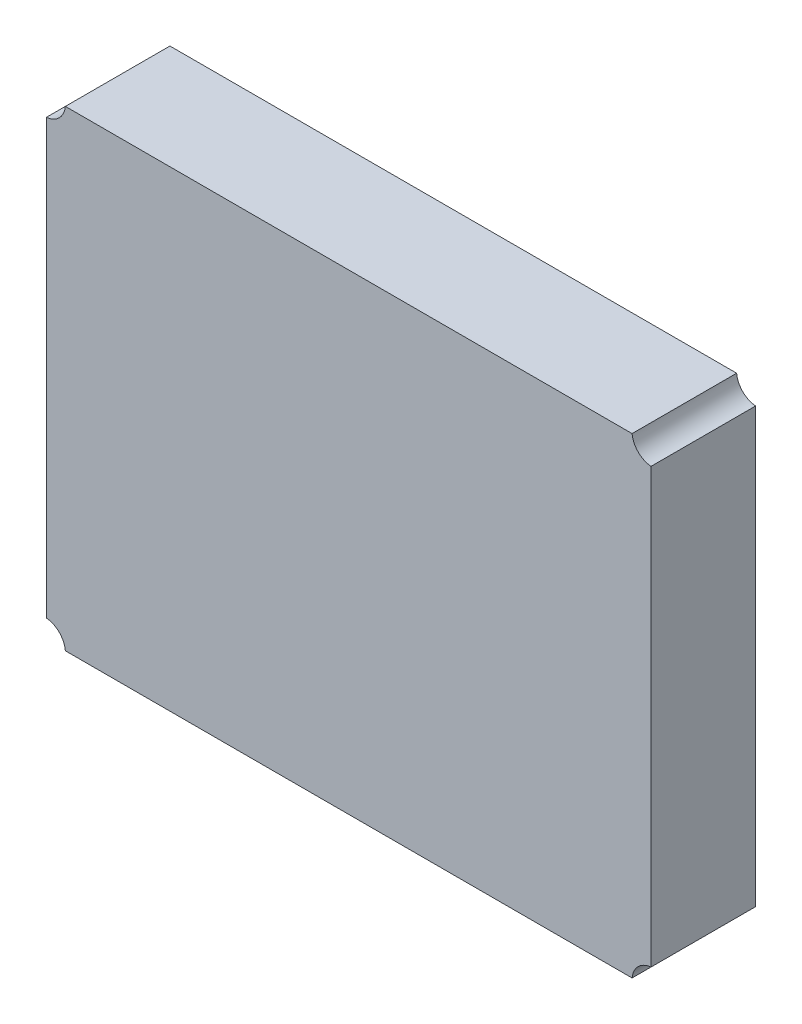
ISO-10303-21;
HEADER;
FILE_DESCRIPTION(('STEP AP214'),'2;1');
FILE_NAME('part.step','',(''),(''),'','','');
FILE_SCHEMA(('AUTOMOTIVE_DESIGN { 1 0 10303 214 1 1 1 1 }'));
ENDSEC;
DATA;
#1=APPLICATION_CONTEXT('core data for automotive mechanical design processes');
#2=APPLICATION_PROTOCOL_DEFINITION('international standard','automotive_design',2000,#1);
#3=PRODUCT_CONTEXT('',#1,'mechanical');
#4=PRODUCT('Part','Part','',(#3));
#5=PRODUCT_RELATED_PRODUCT_CATEGORY('part','',(#4));
#6=PRODUCT_DEFINITION_FORMATION('','',#4);
#7=PRODUCT_DEFINITION_CONTEXT('part definition',#1,'design');
#8=PRODUCT_DEFINITION('design','',#6,#7);
#9=PRODUCT_DEFINITION_SHAPE('','',#8);
#10=(LENGTH_UNIT() NAMED_UNIT(*) SI_UNIT(.MILLI.,.METRE.));
#11=(NAMED_UNIT(*) PLANE_ANGLE_UNIT() SI_UNIT($,.RADIAN.));
#12=(NAMED_UNIT(*) SI_UNIT($,.STERADIAN.) SOLID_ANGLE_UNIT());
#13=UNCERTAINTY_MEASURE_WITH_UNIT(LENGTH_MEASURE(1.E-05),#10,'distance_accuracy_value','');
#14=(GEOMETRIC_REPRESENTATION_CONTEXT(3) GLOBAL_UNCERTAINTY_ASSIGNED_CONTEXT((#13)) GLOBAL_UNIT_ASSIGNED_CONTEXT((#10,
#11,#12)) REPRESENTATION_CONTEXT('',''));
#15=CARTESIAN_POINT('',(0.,0.,0.));
#16=DIRECTION('',(0.,0.,1.));
#17=DIRECTION('',(1.,0.,0.));
#18=AXIS2_PLACEMENT_3D('',#15,#16,#17);
#19=CARTESIAN_POINT('',(-1.59,-1.24,0.05));
#20=DIRECTION('',(0.,0.,-1.));
#21=DIRECTION('',(-1.,0.,0.));
#22=AXIS2_PLACEMENT_3D('',#19,#20,#21);
#23=PLANE('',#22);
#24=DIRECTION('',(0.,1.,0.));
#25=VECTOR('',#24,1.);
#26=CARTESIAN_POINT('',(-1.59,-1.140455488499,0.05));
#27=LINE('',#26,#25);
#28=CARTESIAN_POINT('',(-1.59,1.14045548849897,0.05));
#29=VERTEX_POINT('',#28);
#30=CARTESIAN_POINT('',(-1.59,-1.14045548849897,0.05));
#31=VERTEX_POINT('',#30);
#32=EDGE_CURVE('E107',#29,#31,#27,.F.);
#33=ORIENTED_EDGE('',*,*,#32,.F.);
#34=CARTESIAN_POINT('',(-1.6,1.25,0.0499999999999999));
#35=DIRECTION('',(0.,0.,-1.));
#36=DIRECTION('',(-1.,0.,0.));
#37=AXIS2_PLACEMENT_3D('',#34,#35,#36);
#38=CIRCLE('',#37,0.11);
#39=CARTESIAN_POINT('',(-1.49045548849897,1.24,0.05));
#40=VERTEX_POINT('',#39);
#41=EDGE_CURVE('E110',#29,#40,#38,.F.);
#42=ORIENTED_EDGE('',*,*,#41,.T.);
#43=DIRECTION('',(1.,0.,0.));
#44=VECTOR('',#43,1.);
#45=CARTESIAN_POINT('',(-1.490455488499,1.24,0.05));
#46=LINE('',#45,#44);
#47=CARTESIAN_POINT('',(1.49045548849897,1.24,0.05));
#48=VERTEX_POINT('',#47);
#49=EDGE_CURVE('E114',#48,#40,#46,.F.);
#50=ORIENTED_EDGE('',*,*,#49,.F.);
#51=CARTESIAN_POINT('',(1.6,1.25,0.0499999999999999));
#52=DIRECTION('',(0.,0.,-1.));
#53=DIRECTION('',(-1.,0.,0.));
#54=AXIS2_PLACEMENT_3D('',#51,#52,#53);
#55=CIRCLE('',#54,0.11);
#56=CARTESIAN_POINT('',(1.59,1.14045548849897,0.05));
#57=VERTEX_POINT('',#56);
#58=EDGE_CURVE('E117',#48,#57,#55,.F.);
#59=ORIENTED_EDGE('',*,*,#58,.T.);
#60=DIRECTION('',(0.,1.,0.));
#61=VECTOR('',#60,1.);
#62=CARTESIAN_POINT('',(1.59,1.140455488499,0.05));
#63=LINE('',#62,#61);
#64=CARTESIAN_POINT('',(1.59,-1.14045548849897,0.05));
#65=VERTEX_POINT('',#64);
#66=EDGE_CURVE('E86',#65,#57,#63,.T.);
#67=ORIENTED_EDGE('',*,*,#66,.F.);
#68=CARTESIAN_POINT('',(1.6,-1.25,0.0499999999999999));
#69=DIRECTION('',(0.,0.,-1.));
#70=DIRECTION('',(-1.,0.,0.));
#71=AXIS2_PLACEMENT_3D('',#68,#69,#70);
#72=CIRCLE('',#71,0.11);
#73=CARTESIAN_POINT('',(1.49045548849897,-1.24,0.05));
#74=VERTEX_POINT('',#73);
#75=EDGE_CURVE('E19',#65,#74,#72,.F.);
#76=ORIENTED_EDGE('',*,*,#75,.T.);
#77=DIRECTION('',(1.,0.,0.));
#78=VECTOR('',#77,1.);
#79=CARTESIAN_POINT('',(1.490455488499,-1.24,0.05));
#80=LINE('',#79,#78);
#81=CARTESIAN_POINT('',(-1.49045548849897,-1.24,0.05));
#82=VERTEX_POINT('',#81);
#83=EDGE_CURVE('E83',#82,#74,#80,.T.);
#84=ORIENTED_EDGE('',*,*,#83,.F.);
#85=CARTESIAN_POINT('',(-1.6,-1.25,0.0499999999999999));
#86=DIRECTION('',(0.,0.,-1.));
#87=DIRECTION('',(-1.,0.,0.));
#88=AXIS2_PLACEMENT_3D('',#85,#86,#87);
#89=CIRCLE('',#88,0.11);
#90=EDGE_CURVE('E103',#82,#31,#89,.F.);
#91=ORIENTED_EDGE('',*,*,#90,.T.);
#92=EDGE_LOOP('',(#33,#42,#50,#59,#67,#76,#84,#91));
#93=FACE_BOUND('',#92,.T.);
#94=ADVANCED_FACE('F16',(#93),#23,.T.);
#95=CARTESIAN_POINT('',(1.59,1.140455488499,0.05));
#96=DIRECTION('',(1.,0.,0.));
#97=DIRECTION('',(0.,0.,-1.));
#98=AXIS2_PLACEMENT_3D('',#95,#96,#97);
#99=PLANE('',#98);
#100=ORIENTED_EDGE('',*,*,#66,.T.);
#101=DIRECTION('',(0.,0.,-1.));
#102=VECTOR('',#101,1.);
#103=CARTESIAN_POINT('',(1.59,1.14045548849897,0.6));
#104=LINE('',#103,#102);
#105=CARTESIAN_POINT('',(1.59,1.14045548849897,0.6));
#106=VERTEX_POINT('',#105);
#107=EDGE_CURVE('E115',#57,#106,#104,.F.);
#108=ORIENTED_EDGE('',*,*,#107,.T.);
#109=DIRECTION('',(0.,1.,0.));
#110=VECTOR('',#109,1.);
#111=CARTESIAN_POINT('',(1.59,-1.24,0.6));
#112=LINE('',#111,#110);
#113=CARTESIAN_POINT('',(1.59,-1.14045548849897,0.6));
#114=VERTEX_POINT('',#113);
#115=EDGE_CURVE('E95',#114,#106,#112,.T.);
#116=ORIENTED_EDGE('',*,*,#115,.F.);
#117=DIRECTION('',(0.,0.,-1.));
#118=VECTOR('',#117,1.);
#119=CARTESIAN_POINT('',(1.59,-1.14045548849897,0.6));
#120=LINE('',#119,#118);
#121=EDGE_CURVE('E93',#114,#65,#120,.T.);
#122=ORIENTED_EDGE('',*,*,#121,.T.);
#123=EDGE_LOOP('',(#100,#108,#116,#122));
#124=FACE_BOUND('',#123,.T.);
#125=ADVANCED_FACE('F139',(#124),#99,.T.);
#126=CARTESIAN_POINT('',(1.6,1.25,0.6));
#127=DIRECTION('',(0.,0.,-1.));
#128=DIRECTION('',(-1.,0.,0.));
#129=AXIS2_PLACEMENT_3D('',#126,#127,#128);
#130=CYLINDRICAL_SURFACE('',#129,0.11);
#131=ORIENTED_EDGE('',*,*,#107,.F.);
#132=ORIENTED_EDGE('',*,*,#58,.F.);
#133=DIRECTION('',(0.,0.,1.));
#134=VECTOR('',#133,1.);
#135=CARTESIAN_POINT('',(1.49045548849897,1.24,0.05));
#136=LINE('',#135,#134);
#137=CARTESIAN_POINT('',(1.49045548849897,1.24,0.6));
#138=VERTEX_POINT('',#137);
#139=EDGE_CURVE('E111',#138,#48,#136,.F.);
#140=ORIENTED_EDGE('',*,*,#139,.F.);
#141=CARTESIAN_POINT('',(1.6,1.25,0.6));
#142=DIRECTION('',(0.,0.,-1.));
#143=DIRECTION('',(-1.,0.,0.));
#144=AXIS2_PLACEMENT_3D('',#141,#142,#143);
#145=CIRCLE('',#144,0.11);
#146=EDGE_CURVE('E131',#106,#138,#145,.T.);
#147=ORIENTED_EDGE('',*,*,#146,.F.);
#148=EDGE_LOOP('',(#131,#132,#140,#147));
#149=FACE_BOUND('',#148,.T.);
#150=ADVANCED_FACE('F141',(#149),#130,.F.);
#151=CARTESIAN_POINT('',(-1.490455488499,1.24,0.05));
#152=DIRECTION('',(0.,1.,0.));
#153=DIRECTION('',(0.,0.,1.));
#154=AXIS2_PLACEMENT_3D('',#151,#152,#153);
#155=PLANE('',#154);
#156=ORIENTED_EDGE('',*,*,#49,.T.);
#157=DIRECTION('',(0.,0.,-1.));
#158=VECTOR('',#157,1.);
#159=CARTESIAN_POINT('',(-1.49045548849897,1.24,0.6));
#160=LINE('',#159,#158);
#161=CARTESIAN_POINT('',(-1.49045548849897,1.24,0.6));
#162=VERTEX_POINT('',#161);
#163=EDGE_CURVE('E108',#40,#162,#160,.F.);
#164=ORIENTED_EDGE('',*,*,#163,.T.);
#165=DIRECTION('',(1.,0.,0.));
#166=VECTOR('',#165,1.);
#167=CARTESIAN_POINT('',(-1.59,1.24,0.6));
#168=LINE('',#167,#166);
#169=EDGE_CURVE('E130',#138,#162,#168,.F.);
#170=ORIENTED_EDGE('',*,*,#169,.F.);
#171=ORIENTED_EDGE('',*,*,#139,.T.);
#172=EDGE_LOOP('',(#156,#164,#170,#171));
#173=FACE_BOUND('',#172,.T.);
#174=ADVANCED_FACE('F153',(#173),#155,.T.);
#175=CARTESIAN_POINT('',(-1.6,1.25,0.6));
#176=DIRECTION('',(0.,0.,-1.));
#177=DIRECTION('',(-1.,0.,0.));
#178=AXIS2_PLACEMENT_3D('',#175,#176,#177);
#179=CYLINDRICAL_SURFACE('',#178,0.11);
#180=CARTESIAN_POINT('',(-1.6,1.25,0.6));
#181=DIRECTION('',(0.,0.,-1.));
#182=DIRECTION('',(-1.,0.,0.));
#183=AXIS2_PLACEMENT_3D('',#180,#181,#182);
#184=CIRCLE('',#183,0.11);
#185=CARTESIAN_POINT('',(-1.59,1.14045548849897,0.6));
#186=VERTEX_POINT('',#185);
#187=EDGE_CURVE('E127',#162,#186,#184,.T.);
#188=ORIENTED_EDGE('',*,*,#187,.F.);
#189=ORIENTED_EDGE('',*,*,#163,.F.);
#190=ORIENTED_EDGE('',*,*,#41,.F.);
#191=DIRECTION('',(0.,0.,1.));
#192=VECTOR('',#191,1.);
#193=CARTESIAN_POINT('',(-1.59,1.14045548849897,0.05));
#194=LINE('',#193,#192);
#195=EDGE_CURVE('E104',#186,#29,#194,.F.);
#196=ORIENTED_EDGE('',*,*,#195,.F.);
#197=EDGE_LOOP('',(#188,#189,#190,#196));
#198=FACE_BOUND('',#197,.T.);
#199=ADVANCED_FACE('F156',(#198),#179,.F.);
#200=CARTESIAN_POINT('',(-1.59,-1.140455488499,0.05));
#201=DIRECTION('',(-1.,0.,0.));
#202=DIRECTION('',(0.,0.,1.));
#203=AXIS2_PLACEMENT_3D('',#200,#201,#202);
#204=PLANE('',#203);
#205=ORIENTED_EDGE('',*,*,#32,.T.);
#206=DIRECTION('',(0.,0.,-1.));
#207=VECTOR('',#206,1.);
#208=CARTESIAN_POINT('',(-1.59,-1.14045548849897,0.6));
#209=LINE('',#208,#207);
#210=CARTESIAN_POINT('',(-1.59,-1.14045548849897,0.6));
#211=VERTEX_POINT('',#210);
#212=EDGE_CURVE('E101',#31,#211,#209,.F.);
#213=ORIENTED_EDGE('',*,*,#212,.T.);
#214=DIRECTION('',(0.,1.,0.));
#215=VECTOR('',#214,1.);
#216=CARTESIAN_POINT('',(-1.59,-1.24,0.6));
#217=LINE('',#216,#215);
#218=EDGE_CURVE('E126',#186,#211,#217,.F.);
#219=ORIENTED_EDGE('',*,*,#218,.F.);
#220=ORIENTED_EDGE('',*,*,#195,.T.);
#221=EDGE_LOOP('',(#205,#213,#219,#220));
#222=FACE_BOUND('',#221,.T.);
#223=ADVANCED_FACE('F159',(#222),#204,.T.);
#224=CARTESIAN_POINT('',(-1.6,-1.25,0.6));
#225=DIRECTION('',(0.,0.,-1.));
#226=DIRECTION('',(-1.,0.,0.));
#227=AXIS2_PLACEMENT_3D('',#224,#225,#226);
#228=CYLINDRICAL_SURFACE('',#227,0.11);
#229=ORIENTED_EDGE('',*,*,#212,.F.);
#230=ORIENTED_EDGE('',*,*,#90,.F.);
#231=DIRECTION('',(0.,0.,-1.));
#232=VECTOR('',#231,1.);
#233=CARTESIAN_POINT('',(-1.49045548849897,-1.24,0.05));
#234=LINE('',#233,#232);
#235=CARTESIAN_POINT('',(-1.49045548849897,-1.24,0.6));
#236=VERTEX_POINT('',#235);
#237=EDGE_CURVE('E89',#236,#82,#234,.T.);
#238=ORIENTED_EDGE('',*,*,#237,.F.);
#239=CARTESIAN_POINT('',(-1.6,-1.25,0.6));
#240=DIRECTION('',(0.,0.,-1.));
#241=DIRECTION('',(-1.,0.,0.));
#242=AXIS2_PLACEMENT_3D('',#239,#240,#241);
#243=CIRCLE('',#242,0.11);
#244=EDGE_CURVE('E123',#211,#236,#243,.T.);
#245=ORIENTED_EDGE('',*,*,#244,.F.);
#246=EDGE_LOOP('',(#229,#230,#238,#245));
#247=FACE_BOUND('',#246,.T.);
#248=ADVANCED_FACE('F162',(#247),#228,.F.);
#249=CARTESIAN_POINT('',(1.490455488499,-1.24,0.05));
#250=DIRECTION('',(0.,-1.,0.));
#251=DIRECTION('',(0.,0.,-1.));
#252=AXIS2_PLACEMENT_3D('',#249,#250,#251);
#253=PLANE('',#252);
#254=ORIENTED_EDGE('',*,*,#83,.T.);
#255=DIRECTION('',(0.,0.,-1.));
#256=VECTOR('',#255,1.);
#257=CARTESIAN_POINT('',(1.49045548849897,-1.24,0.6));
#258=LINE('',#257,#256);
#259=CARTESIAN_POINT('',(1.49045548849897,-1.24,0.6));
#260=VERTEX_POINT('',#259);
#261=EDGE_CURVE('E34',#74,#260,#258,.F.);
#262=ORIENTED_EDGE('',*,*,#261,.T.);
#263=DIRECTION('',(1.,0.,0.));
#264=VECTOR('',#263,1.);
#265=CARTESIAN_POINT('',(-1.59,-1.24,0.6));
#266=LINE('',#265,#264);
#267=EDGE_CURVE('E25',#236,#260,#266,.T.);
#268=ORIENTED_EDGE('',*,*,#267,.F.);
#269=ORIENTED_EDGE('',*,*,#237,.T.);
#270=EDGE_LOOP('',(#254,#262,#268,#269));
#271=FACE_BOUND('',#270,.T.);
#272=ADVANCED_FACE('F88',(#271),#253,.T.);
#273=CARTESIAN_POINT('',(1.6,-1.25,0.6));
#274=DIRECTION('',(0.,0.,-1.));
#275=DIRECTION('',(-1.,0.,0.));
#276=AXIS2_PLACEMENT_3D('',#273,#274,#275);
#277=CYLINDRICAL_SURFACE('',#276,0.11);
#278=CARTESIAN_POINT('',(1.6,-1.25,0.6));
#279=DIRECTION('',(0.,0.,-1.));
#280=DIRECTION('',(-1.,0.,0.));
#281=AXIS2_PLACEMENT_3D('',#278,#279,#280);
#282=CIRCLE('',#281,0.11);
#283=EDGE_CURVE('E11',#260,#114,#282,.T.);
#284=ORIENTED_EDGE('',*,*,#283,.F.);
#285=ORIENTED_EDGE('',*,*,#261,.F.);
#286=ORIENTED_EDGE('',*,*,#75,.F.);
#287=ORIENTED_EDGE('',*,*,#121,.F.);
#288=EDGE_LOOP('',(#284,#285,#286,#287));
#289=FACE_BOUND('',#288,.T.);
#290=ADVANCED_FACE('F91',(#289),#277,.F.);
#291=CARTESIAN_POINT('',(-1.59,-1.24,0.6));
#292=DIRECTION('',(0.,0.,1.));
#293=DIRECTION('',(1.,0.,0.));
#294=AXIS2_PLACEMENT_3D('',#291,#292,#293);
#295=PLANE('',#294);
#296=ORIENTED_EDGE('',*,*,#267,.T.);
#297=ORIENTED_EDGE('',*,*,#283,.T.);
#298=ORIENTED_EDGE('',*,*,#115,.T.);
#299=ORIENTED_EDGE('',*,*,#146,.T.);
#300=ORIENTED_EDGE('',*,*,#169,.T.);
#301=ORIENTED_EDGE('',*,*,#187,.T.);
#302=ORIENTED_EDGE('',*,*,#218,.T.);
#303=ORIENTED_EDGE('',*,*,#244,.T.);
#304=EDGE_LOOP('',(#296,#297,#298,#299,#300,#301,#302,#303));
#305=FACE_BOUND('',#304,.T.);
#306=ADVANCED_FACE('F146',(#305),#295,.T.);
#307=CLOSED_SHELL('',(#94,#125,#150,#174,#199,#223,#248,#272,#290,#306));
#308=MANIFOLD_SOLID_BREP('B1',#307);
#309=ADVANCED_BREP_SHAPE_REPRESENTATION('',(#18,#308),#14);
#310=SHAPE_DEFINITION_REPRESENTATION(#9,#309);
ENDSEC;
END-ISO-10303-21;
